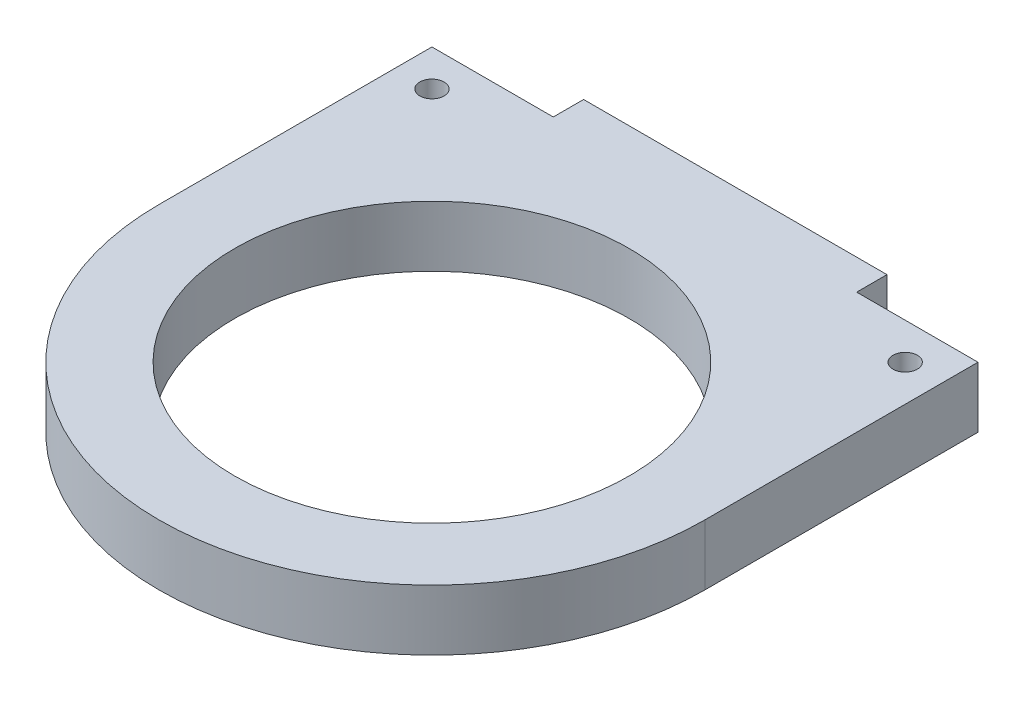
ISO-10303-21;
HEADER;
FILE_DESCRIPTION(('STEP AP214'),'2;1');
FILE_NAME('part.step','',(''),(''),'','','');
FILE_SCHEMA(('AUTOMOTIVE_DESIGN { 1 0 10303 214 1 1 1 1 }'));
ENDSEC;
DATA;
#1=APPLICATION_CONTEXT('core data for automotive mechanical design processes');
#2=APPLICATION_PROTOCOL_DEFINITION('international standard','automotive_design',2000,#1);
#3=PRODUCT_CONTEXT('',#1,'mechanical');
#4=PRODUCT('Part','Part','',(#3));
#5=PRODUCT_RELATED_PRODUCT_CATEGORY('part','',(#4));
#6=PRODUCT_DEFINITION_FORMATION('','',#4);
#7=PRODUCT_DEFINITION_CONTEXT('part definition',#1,'design');
#8=PRODUCT_DEFINITION('design','',#6,#7);
#9=PRODUCT_DEFINITION_SHAPE('','',#8);
#10=(LENGTH_UNIT() NAMED_UNIT(*) SI_UNIT(.MILLI.,.METRE.));
#11=(NAMED_UNIT(*) PLANE_ANGLE_UNIT() SI_UNIT($,.RADIAN.));
#12=(NAMED_UNIT(*) SI_UNIT($,.STERADIAN.) SOLID_ANGLE_UNIT());
#13=UNCERTAINTY_MEASURE_WITH_UNIT(LENGTH_MEASURE(1.E-05),#10,'distance_accuracy_value','');
#14=(GEOMETRIC_REPRESENTATION_CONTEXT(3) GLOBAL_UNCERTAINTY_ASSIGNED_CONTEXT((#13)) GLOBAL_UNIT_ASSIGNED_CONTEXT((#10,
#11,#12)) REPRESENTATION_CONTEXT('',''));
#15=CARTESIAN_POINT('',(0.,0.,0.));
#16=DIRECTION('',(0.,0.,1.));
#17=DIRECTION('',(1.,0.,0.));
#18=AXIS2_PLACEMENT_3D('',#15,#16,#17);
#19=CARTESIAN_POINT('',(0.,10.,0.));
#20=DIRECTION('',(0.,1.,0.));
#21=DIRECTION('',(0.,0.,1.));
#22=AXIS2_PLACEMENT_3D('',#19,#20,#21);
#23=PLANE('',#22);
#24=CARTESIAN_POINT('',(-39.,10.,-39.));
#25=DIRECTION('',(0.,1.,0.));
#26=DIRECTION('',(0.,0.,1.));
#27=AXIS2_PLACEMENT_3D('',#24,#25,#26);
#28=CIRCLE('',#27,2.);
#29=CARTESIAN_POINT('',(-39.,10.,-37.));
#30=VERTEX_POINT('',#29);
#31=EDGE_CURVE('E182',#30,#30,#28,.T.);
#32=ORIENTED_EDGE('',*,*,#31,.F.);
#33=EDGE_LOOP('',(#32));
#34=FACE_BOUND('',#33,.T.);
#35=DIRECTION('',(0.,0.,1.));
#36=VECTOR('',#35,1.);
#37=CARTESIAN_POINT('',(-45.,10.,-45.));
#38=LINE('',#37,#36);
#39=CARTESIAN_POINT('',(-45.,10.,-45.));
#40=VERTEX_POINT('',#39);
#41=CARTESIAN_POINT('',(-45.,10.,0.));
#42=VERTEX_POINT('',#41);
#43=EDGE_CURVE('E145',#40,#42,#38,.T.);
#44=ORIENTED_EDGE('',*,*,#43,.T.);
#45=CARTESIAN_POINT('',(0.,10.,0.));
#46=DIRECTION('',(0.,1.,0.));
#47=DIRECTION('',(0.,0.,1.));
#48=AXIS2_PLACEMENT_3D('',#45,#46,#47);
#49=CIRCLE('',#48,45.);
#50=CARTESIAN_POINT('',(45.,10.,0.));
#51=VERTEX_POINT('',#50);
#52=EDGE_CURVE('E93',#42,#51,#49,.T.);
#53=ORIENTED_EDGE('',*,*,#52,.T.);
#54=DIRECTION('',(0.,0.,-1.));
#55=VECTOR('',#54,1.);
#56=CARTESIAN_POINT('',(45.,10.,-45.));
#57=LINE('',#56,#55);
#58=CARTESIAN_POINT('',(45.,10.,-45.));
#59=VERTEX_POINT('',#58);
#60=EDGE_CURVE('E160',#51,#59,#57,.T.);
#61=ORIENTED_EDGE('',*,*,#60,.T.);
#62=DIRECTION('',(-1.,0.,0.));
#63=VECTOR('',#62,1.);
#64=CARTESIAN_POINT('',(25.,10.,-45.));
#65=LINE('',#64,#63);
#66=CARTESIAN_POINT('',(25.,10.,-45.));
#67=VERTEX_POINT('',#66);
#68=EDGE_CURVE('E173',#59,#67,#65,.T.);
#69=ORIENTED_EDGE('',*,*,#68,.T.);
#70=DIRECTION('',(0.,0.,-1.));
#71=VECTOR('',#70,1.);
#72=CARTESIAN_POINT('',(25.,10.,-50.));
#73=LINE('',#72,#71);
#74=CARTESIAN_POINT('',(25.,10.,-50.));
#75=VERTEX_POINT('',#74);
#76=EDGE_CURVE('E112',#67,#75,#73,.T.);
#77=ORIENTED_EDGE('',*,*,#76,.T.);
#78=DIRECTION('',(-1.,0.,0.));
#79=VECTOR('',#78,1.);
#80=CARTESIAN_POINT('',(-25.,10.,-50.));
#81=LINE('',#80,#79);
#82=CARTESIAN_POINT('',(-25.,10.,-50.));
#83=VERTEX_POINT('',#82);
#84=EDGE_CURVE('E106',#75,#83,#81,.T.);
#85=ORIENTED_EDGE('',*,*,#84,.T.);
#86=DIRECTION('',(0.,0.,1.));
#87=VECTOR('',#86,1.);
#88=CARTESIAN_POINT('',(-25.,10.,-45.));
#89=LINE('',#88,#87);
#90=CARTESIAN_POINT('',(-25.,10.,-45.));
#91=VERTEX_POINT('',#90);
#92=EDGE_CURVE('E110',#83,#91,#89,.T.);
#93=ORIENTED_EDGE('',*,*,#92,.T.);
#94=DIRECTION('',(-1.,0.,0.));
#95=VECTOR('',#94,1.);
#96=CARTESIAN_POINT('',(-45.,10.,-45.));
#97=LINE('',#96,#95);
#98=EDGE_CURVE('E50',#91,#40,#97,.T.);
#99=ORIENTED_EDGE('',*,*,#98,.T.);
#100=EDGE_LOOP('',(#44,#53,#61,#69,#77,#85,#93,#99));
#101=FACE_BOUND('',#100,.T.);
#102=CARTESIAN_POINT('',(0.,10.,0.));
#103=DIRECTION('',(0.,1.,0.));
#104=DIRECTION('',(0.,0.,1.));
#105=AXIS2_PLACEMENT_3D('',#102,#103,#104);
#106=CIRCLE('',#105,32.5);
#107=CARTESIAN_POINT('',(0.,10.,32.5));
#108=VERTEX_POINT('',#107);
#109=EDGE_CURVE('E134',#108,#108,#106,.T.);
#110=ORIENTED_EDGE('',*,*,#109,.F.);
#111=EDGE_LOOP('',(#110));
#112=FACE_BOUND('',#111,.T.);
#113=CARTESIAN_POINT('',(39.,10.,-39.));
#114=DIRECTION('',(0.,1.,0.));
#115=DIRECTION('',(0.,0.,1.));
#116=AXIS2_PLACEMENT_3D('',#113,#114,#115);
#117=CIRCLE('',#116,2.);
#118=CARTESIAN_POINT('',(39.,10.,-37.));
#119=VERTEX_POINT('',#118);
#120=EDGE_CURVE('E188',#119,#119,#117,.T.);
#121=ORIENTED_EDGE('',*,*,#120,.F.);
#122=EDGE_LOOP('',(#121));
#123=FACE_BOUND('',#122,.T.);
#124=ADVANCED_FACE('F33',(#34,#101,#112,#123),#23,.T.);
#125=CARTESIAN_POINT('',(0.,0.,0.));
#126=DIRECTION('',(0.,1.,0.));
#127=DIRECTION('',(0.,0.,1.));
#128=AXIS2_PLACEMENT_3D('',#125,#126,#127);
#129=PLANE('',#128);
#130=DIRECTION('',(0.,0.,1.));
#131=VECTOR('',#130,1.);
#132=CARTESIAN_POINT('',(-45.,0.,-45.));
#133=LINE('',#132,#131);
#134=CARTESIAN_POINT('',(-45.,0.,-45.));
#135=VERTEX_POINT('',#134);
#136=CARTESIAN_POINT('',(-45.,0.,0.));
#137=VERTEX_POINT('',#136);
#138=EDGE_CURVE('E130',#135,#137,#133,.T.);
#139=ORIENTED_EDGE('',*,*,#138,.F.);
#140=DIRECTION('',(-1.,0.,0.));
#141=VECTOR('',#140,1.);
#142=CARTESIAN_POINT('',(-45.,0.,-45.));
#143=LINE('',#142,#141);
#144=CARTESIAN_POINT('',(-25.,0.,-45.));
#145=VERTEX_POINT('',#144);
#146=EDGE_CURVE('E85',#145,#135,#143,.T.);
#147=ORIENTED_EDGE('',*,*,#146,.F.);
#148=DIRECTION('',(0.,0.,1.));
#149=VECTOR('',#148,1.);
#150=CARTESIAN_POINT('',(-25.,0.,-45.));
#151=LINE('',#150,#149);
#152=CARTESIAN_POINT('',(-25.,0.,-50.));
#153=VERTEX_POINT('',#152);
#154=EDGE_CURVE('E79',#153,#145,#151,.T.);
#155=ORIENTED_EDGE('',*,*,#154,.F.);
#156=DIRECTION('',(-1.,0.,0.));
#157=VECTOR('',#156,1.);
#158=CARTESIAN_POINT('',(-25.,0.,-50.));
#159=LINE('',#158,#157);
#160=CARTESIAN_POINT('',(25.,0.,-50.));
#161=VERTEX_POINT('',#160);
#162=EDGE_CURVE('E120',#161,#153,#159,.T.);
#163=ORIENTED_EDGE('',*,*,#162,.F.);
#164=DIRECTION('',(0.,0.,-1.));
#165=VECTOR('',#164,1.);
#166=CARTESIAN_POINT('',(25.,0.,-50.));
#167=LINE('',#166,#165);
#168=CARTESIAN_POINT('',(25.,0.,-45.));
#169=VERTEX_POINT('',#168);
#170=EDGE_CURVE('E140',#169,#161,#167,.T.);
#171=ORIENTED_EDGE('',*,*,#170,.F.);
#172=DIRECTION('',(-1.,0.,0.));
#173=VECTOR('',#172,1.);
#174=CARTESIAN_POINT('',(25.,0.,-45.));
#175=LINE('',#174,#173);
#176=CARTESIAN_POINT('',(45.,0.,-45.));
#177=VERTEX_POINT('',#176);
#178=EDGE_CURVE('E138',#177,#169,#175,.T.);
#179=ORIENTED_EDGE('',*,*,#178,.F.);
#180=DIRECTION('',(0.,0.,-1.));
#181=VECTOR('',#180,1.);
#182=CARTESIAN_POINT('',(45.,0.,-45.));
#183=LINE('',#182,#181);
#184=CARTESIAN_POINT('',(45.,0.,0.));
#185=VERTEX_POINT('',#184);
#186=EDGE_CURVE('E136',#185,#177,#183,.T.);
#187=ORIENTED_EDGE('',*,*,#186,.F.);
#188=CARTESIAN_POINT('',(0.,0.,0.));
#189=DIRECTION('',(0.,1.,0.));
#190=DIRECTION('',(0.,0.,1.));
#191=AXIS2_PLACEMENT_3D('',#188,#189,#190);
#192=CIRCLE('',#191,45.);
#193=EDGE_CURVE('E133',#137,#185,#192,.T.);
#194=ORIENTED_EDGE('',*,*,#193,.F.);
#195=EDGE_LOOP('',(#139,#147,#155,#163,#171,#179,#187,#194));
#196=FACE_BOUND('',#195,.T.);
#197=CARTESIAN_POINT('',(0.,0.,0.));
#198=DIRECTION('',(0.,1.,0.));
#199=DIRECTION('',(0.,0.,1.));
#200=AXIS2_PLACEMENT_3D('',#197,#198,#199);
#201=CIRCLE('',#200,32.5);
#202=CARTESIAN_POINT('',(0.,0.,32.5));
#203=VERTEX_POINT('',#202);
#204=EDGE_CURVE('E179',#203,#203,#201,.T.);
#205=ORIENTED_EDGE('',*,*,#204,.T.);
#206=EDGE_LOOP('',(#205));
#207=FACE_BOUND('',#206,.T.);
#208=CARTESIAN_POINT('',(-39.,0.,-39.));
#209=DIRECTION('',(0.,1.,0.));
#210=DIRECTION('',(0.,0.,1.));
#211=AXIS2_PLACEMENT_3D('',#208,#209,#210);
#212=CIRCLE('',#211,2.);
#213=CARTESIAN_POINT('',(-39.,0.,-37.));
#214=VERTEX_POINT('',#213);
#215=EDGE_CURVE('E185',#214,#214,#212,.T.);
#216=ORIENTED_EDGE('',*,*,#215,.T.);
#217=EDGE_LOOP('',(#216));
#218=FACE_BOUND('',#217,.T.);
#219=CARTESIAN_POINT('',(39.,0.,-39.));
#220=DIRECTION('',(0.,1.,0.));
#221=DIRECTION('',(0.,0.,1.));
#222=AXIS2_PLACEMENT_3D('',#219,#220,#221);
#223=CIRCLE('',#222,2.);
#224=CARTESIAN_POINT('',(39.,0.,-37.));
#225=VERTEX_POINT('',#224);
#226=EDGE_CURVE('E191',#225,#225,#223,.T.);
#227=ORIENTED_EDGE('',*,*,#226,.T.);
#228=EDGE_LOOP('',(#227));
#229=FACE_BOUND('',#228,.T.);
#230=ADVANCED_FACE('F164',(#196,#207,#218,#229),#129,.F.);
#231=CARTESIAN_POINT('',(-45.,10.,-45.));
#232=DIRECTION('',(1.,0.,0.));
#233=DIRECTION('',(0.,0.,-1.));
#234=AXIS2_PLACEMENT_3D('',#231,#232,#233);
#235=PLANE('',#234);
#236=ORIENTED_EDGE('',*,*,#138,.T.);
#237=DIRECTION('',(0.,-1.,0.));
#238=VECTOR('',#237,1.);
#239=CARTESIAN_POINT('',(-45.,10.,0.));
#240=LINE('',#239,#238);
#241=EDGE_CURVE('E11',#42,#137,#240,.T.);
#242=ORIENTED_EDGE('',*,*,#241,.F.);
#243=ORIENTED_EDGE('',*,*,#43,.F.);
#244=DIRECTION('',(0.,-1.,0.));
#245=VECTOR('',#244,1.);
#246=CARTESIAN_POINT('',(-45.,10.,-45.));
#247=LINE('',#246,#245);
#248=EDGE_CURVE('E126',#40,#135,#247,.T.);
#249=ORIENTED_EDGE('',*,*,#248,.T.);
#250=EDGE_LOOP('',(#236,#242,#243,#249));
#251=FACE_BOUND('',#250,.T.);
#252=ADVANCED_FACE('F35',(#251),#235,.F.);
#253=CARTESIAN_POINT('',(0.,10.,0.));
#254=DIRECTION('',(0.,-1.,0.));
#255=DIRECTION('',(0.,0.,-1.));
#256=AXIS2_PLACEMENT_3D('',#253,#254,#255);
#257=CYLINDRICAL_SURFACE('',#256,45.);
#258=ORIENTED_EDGE('',*,*,#193,.T.);
#259=DIRECTION('',(0.,-1.,0.));
#260=VECTOR('',#259,1.);
#261=CARTESIAN_POINT('',(45.,10.,0.));
#262=LINE('',#261,#260);
#263=EDGE_CURVE('E42',#51,#185,#262,.T.);
#264=ORIENTED_EDGE('',*,*,#263,.F.);
#265=ORIENTED_EDGE('',*,*,#52,.F.);
#266=ORIENTED_EDGE('',*,*,#241,.T.);
#267=EDGE_LOOP('',(#258,#264,#265,#266));
#268=FACE_BOUND('',#267,.T.);
#269=ADVANCED_FACE('F224',(#268),#257,.T.);
#270=CARTESIAN_POINT('',(45.,10.,-45.));
#271=DIRECTION('',(-1.,0.,0.));
#272=DIRECTION('',(0.,0.,1.));
#273=AXIS2_PLACEMENT_3D('',#270,#271,#272);
#274=PLANE('',#273);
#275=ORIENTED_EDGE('',*,*,#186,.T.);
#276=DIRECTION('',(0.,-1.,0.));
#277=VECTOR('',#276,1.);
#278=CARTESIAN_POINT('',(45.,10.,-45.));
#279=LINE('',#278,#277);
#280=EDGE_CURVE('E152',#59,#177,#279,.T.);
#281=ORIENTED_EDGE('',*,*,#280,.F.);
#282=ORIENTED_EDGE('',*,*,#60,.F.);
#283=ORIENTED_EDGE('',*,*,#263,.T.);
#284=EDGE_LOOP('',(#275,#281,#282,#283));
#285=FACE_BOUND('',#284,.T.);
#286=ADVANCED_FACE('F158',(#285),#274,.F.);
#287=CARTESIAN_POINT('',(25.,10.,-45.));
#288=DIRECTION('',(0.,0.,1.));
#289=DIRECTION('',(1.,0.,0.));
#290=AXIS2_PLACEMENT_3D('',#287,#288,#289);
#291=PLANE('',#290);
#292=ORIENTED_EDGE('',*,*,#178,.T.);
#293=DIRECTION('',(0.,-1.,0.));
#294=VECTOR('',#293,1.);
#295=CARTESIAN_POINT('',(25.,10.,-45.));
#296=LINE('',#295,#294);
#297=EDGE_CURVE('E149',#67,#169,#296,.T.);
#298=ORIENTED_EDGE('',*,*,#297,.F.);
#299=ORIENTED_EDGE('',*,*,#68,.F.);
#300=ORIENTED_EDGE('',*,*,#280,.T.);
#301=EDGE_LOOP('',(#292,#298,#299,#300));
#302=FACE_BOUND('',#301,.T.);
#303=ADVANCED_FACE('F169',(#302),#291,.F.);
#304=CARTESIAN_POINT('',(25.,10.,-50.));
#305=DIRECTION('',(-1.,0.,0.));
#306=DIRECTION('',(0.,0.,1.));
#307=AXIS2_PLACEMENT_3D('',#304,#305,#306);
#308=PLANE('',#307);
#309=ORIENTED_EDGE('',*,*,#170,.T.);
#310=DIRECTION('',(0.,-1.,0.));
#311=VECTOR('',#310,1.);
#312=CARTESIAN_POINT('',(25.,10.,-50.));
#313=LINE('',#312,#311);
#314=EDGE_CURVE('E121',#75,#161,#313,.T.);
#315=ORIENTED_EDGE('',*,*,#314,.F.);
#316=ORIENTED_EDGE('',*,*,#76,.F.);
#317=ORIENTED_EDGE('',*,*,#297,.T.);
#318=EDGE_LOOP('',(#309,#315,#316,#317));
#319=FACE_BOUND('',#318,.T.);
#320=ADVANCED_FACE('F172',(#319),#308,.F.);
#321=CARTESIAN_POINT('',(-25.,10.,-50.));
#322=DIRECTION('',(0.,0.,1.));
#323=DIRECTION('',(1.,0.,0.));
#324=AXIS2_PLACEMENT_3D('',#321,#322,#323);
#325=PLANE('',#324);
#326=ORIENTED_EDGE('',*,*,#162,.T.);
#327=DIRECTION('',(0.,-1.,0.));
#328=VECTOR('',#327,1.);
#329=CARTESIAN_POINT('',(-25.,10.,-50.));
#330=LINE('',#329,#328);
#331=EDGE_CURVE('E117',#83,#153,#330,.T.);
#332=ORIENTED_EDGE('',*,*,#331,.F.);
#333=ORIENTED_EDGE('',*,*,#84,.F.);
#334=ORIENTED_EDGE('',*,*,#314,.T.);
#335=EDGE_LOOP('',(#326,#332,#333,#334));
#336=FACE_BOUND('',#335,.T.);
#337=ADVANCED_FACE('F118',(#336),#325,.F.);
#338=CARTESIAN_POINT('',(-25.,10.,-45.));
#339=DIRECTION('',(1.,0.,0.));
#340=DIRECTION('',(0.,0.,-1.));
#341=AXIS2_PLACEMENT_3D('',#338,#339,#340);
#342=PLANE('',#341);
#343=ORIENTED_EDGE('',*,*,#154,.T.);
#344=DIRECTION('',(0.,-1.,0.));
#345=VECTOR('',#344,1.);
#346=CARTESIAN_POINT('',(-25.,10.,-45.));
#347=LINE('',#346,#345);
#348=EDGE_CURVE('E122',#91,#145,#347,.T.);
#349=ORIENTED_EDGE('',*,*,#348,.F.);
#350=ORIENTED_EDGE('',*,*,#92,.F.);
#351=ORIENTED_EDGE('',*,*,#331,.T.);
#352=EDGE_LOOP('',(#343,#349,#350,#351));
#353=FACE_BOUND('',#352,.T.);
#354=ADVANCED_FACE('F124',(#353),#342,.F.);
#355=CARTESIAN_POINT('',(-45.,10.,-45.));
#356=DIRECTION('',(0.,0.,1.));
#357=DIRECTION('',(1.,0.,0.));
#358=AXIS2_PLACEMENT_3D('',#355,#356,#357);
#359=PLANE('',#358);
#360=ORIENTED_EDGE('',*,*,#146,.T.);
#361=ORIENTED_EDGE('',*,*,#248,.F.);
#362=ORIENTED_EDGE('',*,*,#98,.F.);
#363=ORIENTED_EDGE('',*,*,#348,.T.);
#364=EDGE_LOOP('',(#360,#361,#362,#363));
#365=FACE_BOUND('',#364,.T.);
#366=ADVANCED_FACE('F212',(#365),#359,.F.);
#367=CARTESIAN_POINT('',(0.,10.,0.));
#368=DIRECTION('',(0.,-1.,0.));
#369=DIRECTION('',(0.,0.,-1.));
#370=AXIS2_PLACEMENT_3D('',#367,#368,#369);
#371=CYLINDRICAL_SURFACE('',#370,32.5);
#372=ORIENTED_EDGE('',*,*,#109,.T.);
#373=EDGE_LOOP('',(#372));
#374=FACE_BOUND('',#373,.T.);
#375=ORIENTED_EDGE('',*,*,#204,.F.);
#376=EDGE_LOOP('',(#375));
#377=FACE_BOUND('',#376,.T.);
#378=ADVANCED_FACE('F209',(#374,#377),#371,.F.);
#379=CARTESIAN_POINT('',(-39.,10.,-39.));
#380=DIRECTION('',(0.,-1.,0.));
#381=DIRECTION('',(0.,0.,-1.));
#382=AXIS2_PLACEMENT_3D('',#379,#380,#381);
#383=CYLINDRICAL_SURFACE('',#382,2.);
#384=ORIENTED_EDGE('',*,*,#31,.T.);
#385=EDGE_LOOP('',(#384));
#386=FACE_BOUND('',#385,.T.);
#387=ORIENTED_EDGE('',*,*,#215,.F.);
#388=EDGE_LOOP('',(#387));
#389=FACE_BOUND('',#388,.T.);
#390=ADVANCED_FACE('F288',(#386,#389),#383,.F.);
#391=CARTESIAN_POINT('',(39.,10.,-39.));
#392=DIRECTION('',(0.,-1.,0.));
#393=DIRECTION('',(0.,0.,-1.));
#394=AXIS2_PLACEMENT_3D('',#391,#392,#393);
#395=CYLINDRICAL_SURFACE('',#394,2.);
#396=ORIENTED_EDGE('',*,*,#120,.T.);
#397=EDGE_LOOP('',(#396));
#398=FACE_BOUND('',#397,.T.);
#399=ORIENTED_EDGE('',*,*,#226,.F.);
#400=EDGE_LOOP('',(#399));
#401=FACE_BOUND('',#400,.T.);
#402=ADVANCED_FACE('F197',(#398,#401),#395,.F.);
#403=CLOSED_SHELL('',(#124,#230,#252,#269,#286,#303,#320,#337,#354,#366,#378,#390,#402));
#404=MANIFOLD_SOLID_BREP('B2',#403);
#405=ADVANCED_BREP_SHAPE_REPRESENTATION('',(#18,#404),#14);
#406=SHAPE_DEFINITION_REPRESENTATION(#9,#405);
ENDSEC;
END-ISO-10303-21;
